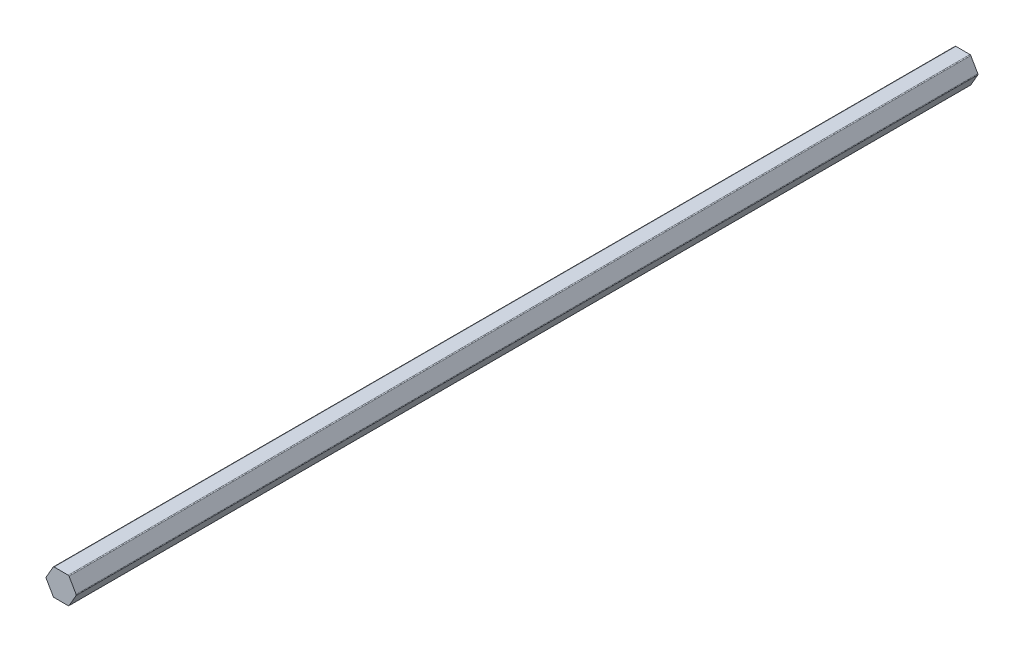
ISO-10303-21;
HEADER;
FILE_DESCRIPTION(('STEP AP214'),'2;1');
FILE_NAME('part.step','',(''),(''),'','','');
FILE_SCHEMA(('AUTOMOTIVE_DESIGN { 1 0 10303 214 1 1 1 1 }'));
ENDSEC;
DATA;
#1=APPLICATION_CONTEXT('core data for automotive mechanical design processes');
#2=APPLICATION_PROTOCOL_DEFINITION('international standard','automotive_design',2000,#1);
#3=PRODUCT_CONTEXT('',#1,'mechanical');
#4=PRODUCT('Part','Part','',(#3));
#5=PRODUCT_RELATED_PRODUCT_CATEGORY('part','',(#4));
#6=PRODUCT_DEFINITION_FORMATION('','',#4);
#7=PRODUCT_DEFINITION_CONTEXT('part definition',#1,'design');
#8=PRODUCT_DEFINITION('design','',#6,#7);
#9=PRODUCT_DEFINITION_SHAPE('','',#8);
#10=(LENGTH_UNIT() NAMED_UNIT(*) SI_UNIT(.MILLI.,.METRE.));
#11=(NAMED_UNIT(*) PLANE_ANGLE_UNIT() SI_UNIT($,.RADIAN.));
#12=(NAMED_UNIT(*) SI_UNIT($,.STERADIAN.) SOLID_ANGLE_UNIT());
#13=UNCERTAINTY_MEASURE_WITH_UNIT(LENGTH_MEASURE(1.E-05),#10,'distance_accuracy_value','');
#14=(GEOMETRIC_REPRESENTATION_CONTEXT(3) GLOBAL_UNCERTAINTY_ASSIGNED_CONTEXT((#13)) GLOBAL_UNIT_ASSIGNED_CONTEXT((#10,
#11,#12)) REPRESENTATION_CONTEXT('',''));
#15=CARTESIAN_POINT('',(0.,0.,0.));
#16=DIRECTION('',(0.,0.,1.));
#17=DIRECTION('',(1.,0.,0.));
#18=AXIS2_PLACEMENT_3D('',#15,#16,#17);
#19=CARTESIAN_POINT('',(-3.36554792418708,-5.8293,457.2));
#20=DIRECTION('',(0.,0.,-1.));
#21=DIRECTION('',(-1.,0.,0.));
#22=AXIS2_PLACEMENT_3D('',#19,#20,#21);
#23=CYLINDRICAL_SURFACE('',#22,0.508);
#24=CARTESIAN_POINT('',(-3.36554792418708,-5.8293,25.4));
#25=DIRECTION('',(0.,0.,1.));
#26=DIRECTION('',(1.,0.,0.));
#27=AXIS2_PLACEMENT_3D('',#24,#25,#26);
#28=CIRCLE('',#27,0.508);
#29=CARTESIAN_POINT('',(-3.36554792418708,-6.3373,25.4));
#30=VERTEX_POINT('',#29);
#31=CARTESIAN_POINT('',(-3.80548882930957,-6.0833,25.4));
#32=VERTEX_POINT('',#31);
#33=EDGE_CURVE('E193',#30,#32,#28,.F.);
#34=ORIENTED_EDGE('',*,*,#33,.F.);
#35=DIRECTION('',(0.,0.,1.));
#36=VECTOR('',#35,1.);
#37=CARTESIAN_POINT('',(-3.36554792418708,-6.3373,457.2));
#38=LINE('',#37,#36);
#39=CARTESIAN_POINT('',(-3.36554792418708,-6.3373,457.2));
#40=VERTEX_POINT('',#39);
#41=EDGE_CURVE('E185',#30,#40,#38,.T.);
#42=ORIENTED_EDGE('',*,*,#41,.T.);
#43=CARTESIAN_POINT('',(-3.36554792418708,-5.8293,457.2));
#44=DIRECTION('',(0.,0.,-1.));
#45=DIRECTION('',(-1.,0.,0.));
#46=AXIS2_PLACEMENT_3D('',#43,#44,#45);
#47=CIRCLE('',#46,0.508);
#48=CARTESIAN_POINT('',(-3.80548882930957,-6.0833,457.2));
#49=VERTEX_POINT('',#48);
#50=EDGE_CURVE('E121',#40,#49,#47,.T.);
#51=ORIENTED_EDGE('',*,*,#50,.T.);
#52=DIRECTION('',(0.,0.,1.));
#53=VECTOR('',#52,1.);
#54=CARTESIAN_POINT('',(-3.80548882930957,-6.0833,457.2));
#55=LINE('',#54,#53);
#56=EDGE_CURVE('E188',#49,#32,#55,.F.);
#57=ORIENTED_EDGE('',*,*,#56,.T.);
#58=EDGE_LOOP('',(#34,#42,#51,#57));
#59=FACE_BOUND('',#58,.T.);
#60=ADVANCED_FACE('F34',(#59),#23,.T.);
#61=CARTESIAN_POINT('',(3.36554792418708,5.8293,457.2));
#62=DIRECTION('',(0.,0.,-1.));
#63=DIRECTION('',(-1.,0.,0.));
#64=AXIS2_PLACEMENT_3D('',#61,#62,#63);
#65=CYLINDRICAL_SURFACE('',#64,0.508);
#66=CARTESIAN_POINT('',(3.36554792418708,5.8293,25.4));
#67=DIRECTION('',(0.,0.,1.));
#68=DIRECTION('',(1.,0.,0.));
#69=AXIS2_PLACEMENT_3D('',#66,#67,#68);
#70=CIRCLE('',#69,0.508);
#71=CARTESIAN_POINT('',(3.36554792418708,6.3373,25.4));
#72=VERTEX_POINT('',#71);
#73=CARTESIAN_POINT('',(3.80548882930958,6.0833,25.4));
#74=VERTEX_POINT('',#73);
#75=EDGE_CURVE('E244',#72,#74,#70,.F.);
#76=ORIENTED_EDGE('',*,*,#75,.F.);
#77=DIRECTION('',(0.,0.,1.));
#78=VECTOR('',#77,1.);
#79=CARTESIAN_POINT('',(3.36554792418708,6.3373,457.2));
#80=LINE('',#79,#78);
#81=CARTESIAN_POINT('',(3.36554792418708,6.3373,457.2));
#82=VERTEX_POINT('',#81);
#83=EDGE_CURVE('E178',#72,#82,#80,.T.);
#84=ORIENTED_EDGE('',*,*,#83,.T.);
#85=CARTESIAN_POINT('',(3.36554792418708,5.8293,457.2));
#86=DIRECTION('',(0.,0.,-1.));
#87=DIRECTION('',(-1.,0.,0.));
#88=AXIS2_PLACEMENT_3D('',#85,#86,#87);
#89=CIRCLE('',#88,0.508);
#90=CARTESIAN_POINT('',(3.80548882930958,6.0833,457.2));
#91=VERTEX_POINT('',#90);
#92=EDGE_CURVE('E145',#82,#91,#89,.T.);
#93=ORIENTED_EDGE('',*,*,#92,.T.);
#94=DIRECTION('',(0.,0.,1.));
#95=VECTOR('',#94,1.);
#96=CARTESIAN_POINT('',(3.80548882930958,6.0833,457.2));
#97=LINE('',#96,#95);
#98=EDGE_CURVE('E180',#91,#74,#97,.F.);
#99=ORIENTED_EDGE('',*,*,#98,.T.);
#100=EDGE_LOOP('',(#76,#84,#93,#99));
#101=FACE_BOUND('',#100,.T.);
#102=ADVANCED_FACE('F243',(#101),#65,.T.);
#103=CARTESIAN_POINT('',(-3.36554792418708,5.8293,457.2));
#104=DIRECTION('',(0.,0.,-1.));
#105=DIRECTION('',(-1.,0.,0.));
#106=AXIS2_PLACEMENT_3D('',#103,#104,#105);
#107=CYLINDRICAL_SURFACE('',#106,0.508);
#108=CARTESIAN_POINT('',(-3.36554792418708,5.8293,25.4));
#109=DIRECTION('',(0.,0.,1.));
#110=DIRECTION('',(1.,0.,0.));
#111=AXIS2_PLACEMENT_3D('',#108,#109,#110);
#112=CIRCLE('',#111,0.508);
#113=CARTESIAN_POINT('',(-3.80548882930958,6.0833,25.4));
#114=VERTEX_POINT('',#113);
#115=CARTESIAN_POINT('',(-3.36554792418708,6.3373,25.4));
#116=VERTEX_POINT('',#115);
#117=EDGE_CURVE('E149',#114,#116,#112,.F.);
#118=ORIENTED_EDGE('',*,*,#117,.F.);
#119=DIRECTION('',(0.,0.,1.));
#120=VECTOR('',#119,1.);
#121=CARTESIAN_POINT('',(-3.80548882930958,6.0833,457.2));
#122=LINE('',#121,#120);
#123=CARTESIAN_POINT('',(-3.80548882930958,6.0833,457.2));
#124=VERTEX_POINT('',#123);
#125=EDGE_CURVE('E173',#114,#124,#122,.T.);
#126=ORIENTED_EDGE('',*,*,#125,.T.);
#127=CARTESIAN_POINT('',(-3.36554792418708,5.8293,457.2));
#128=DIRECTION('',(0.,0.,-1.));
#129=DIRECTION('',(-1.,0.,0.));
#130=AXIS2_PLACEMENT_3D('',#127,#128,#129);
#131=CIRCLE('',#130,0.508);
#132=CARTESIAN_POINT('',(-3.36554792418708,6.3373,457.2));
#133=VERTEX_POINT('',#132);
#134=EDGE_CURVE('E143',#124,#133,#131,.T.);
#135=ORIENTED_EDGE('',*,*,#134,.T.);
#136=DIRECTION('',(0.,0.,1.));
#137=VECTOR('',#136,1.);
#138=CARTESIAN_POINT('',(-3.36554792418708,6.3373,457.2));
#139=LINE('',#138,#137);
#140=EDGE_CURVE('E176',#133,#116,#139,.F.);
#141=ORIENTED_EDGE('',*,*,#140,.T.);
#142=EDGE_LOOP('',(#118,#126,#135,#141));
#143=FACE_BOUND('',#142,.T.);
#144=ADVANCED_FACE('F208',(#143),#107,.T.);
#145=CARTESIAN_POINT('',(-6.73109584837417,0.,457.2));
#146=DIRECTION('',(0.,0.,-1.));
#147=DIRECTION('',(-1.,0.,0.));
#148=AXIS2_PLACEMENT_3D('',#145,#146,#147);
#149=CYLINDRICAL_SURFACE('',#148,0.508);
#150=CARTESIAN_POINT('',(-6.73109584837417,0.,25.4));
#151=DIRECTION('',(0.,0.,1.));
#152=DIRECTION('',(1.,0.,0.));
#153=AXIS2_PLACEMENT_3D('',#150,#151,#152);
#154=CIRCLE('',#153,0.508);
#155=CARTESIAN_POINT('',(-7.17103675349666,-0.254000000000004,25.4));
#156=VERTEX_POINT('',#155);
#157=CARTESIAN_POINT('',(-7.17103675349666,0.253999999999995,25.4));
#158=VERTEX_POINT('',#157);
#159=EDGE_CURVE('E155',#156,#158,#154,.F.);
#160=ORIENTED_EDGE('',*,*,#159,.F.);
#161=DIRECTION('',(0.,0.,1.));
#162=VECTOR('',#161,1.);
#163=CARTESIAN_POINT('',(-7.17103675349666,-0.254000000000004,457.2));
#164=LINE('',#163,#162);
#165=CARTESIAN_POINT('',(-7.17103675349666,-0.254000000000004,457.2));
#166=VERTEX_POINT('',#165);
#167=EDGE_CURVE('E91',#156,#166,#164,.T.);
#168=ORIENTED_EDGE('',*,*,#167,.T.);
#169=CARTESIAN_POINT('',(-6.73109584837417,0.,457.2));
#170=DIRECTION('',(0.,0.,-1.));
#171=DIRECTION('',(-1.,0.,0.));
#172=AXIS2_PLACEMENT_3D('',#169,#170,#171);
#173=CIRCLE('',#172,0.508);
#174=CARTESIAN_POINT('',(-7.17103675349666,0.253999999999996,457.2));
#175=VERTEX_POINT('',#174);
#176=EDGE_CURVE('E141',#166,#175,#173,.T.);
#177=ORIENTED_EDGE('',*,*,#176,.T.);
#178=DIRECTION('',(0.,0.,1.));
#179=VECTOR('',#178,1.);
#180=CARTESIAN_POINT('',(-7.17103675349666,0.253999999999996,457.2));
#181=LINE('',#180,#179);
#182=EDGE_CURVE('E175',#175,#158,#181,.F.);
#183=ORIENTED_EDGE('',*,*,#182,.T.);
#184=EDGE_LOOP('',(#160,#168,#177,#183));
#185=FACE_BOUND('',#184,.T.);
#186=ADVANCED_FACE('F205',(#185),#149,.T.);
#187=CARTESIAN_POINT('',(-7.31768372187083,0.,457.2));
#188=DIRECTION('',(0.866025403784438,0.5,0.));
#189=DIRECTION('',(-0.5,0.866025403784438,0.));
#190=AXIS2_PLACEMENT_3D('',#187,#188,#189);
#191=PLANE('',#190);
#192=ORIENTED_EDGE('',*,*,#167,.F.);
#193=DIRECTION('',(0.5,-0.866025403784438,0.));
#194=VECTOR('',#193,1.);
#195=CARTESIAN_POINT('',(-7.31768372187083,0.,25.4));
#196=LINE('',#195,#194);
#197=EDGE_CURVE('E202',#156,#32,#196,.T.);
#198=ORIENTED_EDGE('',*,*,#197,.T.);
#199=ORIENTED_EDGE('',*,*,#56,.F.);
#200=DIRECTION('',(0.500000000000001,-0.866025403784438,0.));
#201=VECTOR('',#200,1.);
#202=CARTESIAN_POINT('',(-7.17103675349666,-0.254000000000004,457.2));
#203=LINE('',#202,#201);
#204=EDGE_CURVE('E124',#166,#49,#203,.T.);
#205=ORIENTED_EDGE('',*,*,#204,.F.);
#206=EDGE_LOOP('',(#192,#198,#199,#205));
#207=FACE_BOUND('',#206,.T.);
#208=ADVANCED_FACE('F200',(#207),#191,.F.);
#209=CARTESIAN_POINT('',(-3.65884186093541,-6.3373,457.2));
#210=DIRECTION('',(0.,1.,0.));
#211=DIRECTION('',(-1.,0.,0.));
#212=AXIS2_PLACEMENT_3D('',#209,#210,#211);
#213=PLANE('',#212);
#214=ORIENTED_EDGE('',*,*,#41,.F.);
#215=DIRECTION('',(1.,0.,0.));
#216=VECTOR('',#215,1.);
#217=CARTESIAN_POINT('',(-3.65884186093541,-6.3373,25.4));
#218=LINE('',#217,#216);
#219=CARTESIAN_POINT('',(3.36554792418708,-6.3373,25.4));
#220=VERTEX_POINT('',#219);
#221=EDGE_CURVE('E132',#30,#220,#218,.T.);
#222=ORIENTED_EDGE('',*,*,#221,.T.);
#223=DIRECTION('',(0.,0.,-1.));
#224=VECTOR('',#223,1.);
#225=CARTESIAN_POINT('',(3.36554792418708,-6.3373,457.2));
#226=LINE('',#225,#224);
#227=CARTESIAN_POINT('',(3.36554792418708,-6.3373,457.2));
#228=VERTEX_POINT('',#227);
#229=EDGE_CURVE('E128',#228,#220,#226,.T.);
#230=ORIENTED_EDGE('',*,*,#229,.F.);
#231=DIRECTION('',(1.,0.,0.));
#232=VECTOR('',#231,1.);
#233=CARTESIAN_POINT('',(7.31768372187083,-6.3373,457.2));
#234=LINE('',#233,#232);
#235=EDGE_CURVE('E114',#40,#228,#234,.T.);
#236=ORIENTED_EDGE('',*,*,#235,.F.);
#237=EDGE_LOOP('',(#214,#222,#230,#236));
#238=FACE_BOUND('',#237,.T.);
#239=ADVANCED_FACE('F129',(#238),#213,.F.);
#240=CARTESIAN_POINT('',(7.31768372187083,0.,457.2));
#241=DIRECTION('',(-0.866025403784439,-0.5,0.));
#242=DIRECTION('',(0.5,-0.866025403784439,0.));
#243=AXIS2_PLACEMENT_3D('',#240,#241,#242);
#244=PLANE('',#243);
#245=DIRECTION('',(0.,0.,-1.));
#246=VECTOR('',#245,1.);
#247=CARTESIAN_POINT('',(7.17103675349666,0.254000000000004,457.2));
#248=LINE('',#247,#246);
#249=CARTESIAN_POINT('',(7.17103675349666,0.254000000000003,25.4));
#250=VERTEX_POINT('',#249);
#251=CARTESIAN_POINT('',(7.17103675349666,0.254000000000003,457.2));
#252=VERTEX_POINT('',#251);
#253=EDGE_CURVE('E108',#250,#252,#248,.F.);
#254=ORIENTED_EDGE('',*,*,#253,.F.);
#255=DIRECTION('',(-0.5,0.866025403784439,0.));
#256=VECTOR('',#255,1.);
#257=CARTESIAN_POINT('',(7.31768372187083,0.,25.4));
#258=LINE('',#257,#256);
#259=EDGE_CURVE('E240',#250,#74,#258,.T.);
#260=ORIENTED_EDGE('',*,*,#259,.T.);
#261=ORIENTED_EDGE('',*,*,#98,.F.);
#262=DIRECTION('',(-0.5,0.866025403784438,0.));
#263=VECTOR('',#262,1.);
#264=CARTESIAN_POINT('',(7.17103675349666,0.254000000000003,457.2));
#265=LINE('',#264,#263);
#266=EDGE_CURVE('E137',#252,#91,#265,.T.);
#267=ORIENTED_EDGE('',*,*,#266,.F.);
#268=EDGE_LOOP('',(#254,#260,#261,#267));
#269=FACE_BOUND('',#268,.T.);
#270=ADVANCED_FACE('F238',(#269),#244,.F.);
#271=CARTESIAN_POINT('',(3.65884186093541,6.3373,457.2));
#272=DIRECTION('',(0.,-1.,0.));
#273=DIRECTION('',(1.,0.,0.));
#274=AXIS2_PLACEMENT_3D('',#271,#272,#273);
#275=PLANE('',#274);
#276=ORIENTED_EDGE('',*,*,#83,.F.);
#277=DIRECTION('',(-1.,0.,0.));
#278=VECTOR('',#277,1.);
#279=CARTESIAN_POINT('',(3.65884186093541,6.3373,25.4));
#280=LINE('',#279,#278);
#281=EDGE_CURVE('E217',#72,#116,#280,.T.);
#282=ORIENTED_EDGE('',*,*,#281,.T.);
#283=ORIENTED_EDGE('',*,*,#140,.F.);
#284=DIRECTION('',(1.,0.,0.));
#285=VECTOR('',#284,1.);
#286=CARTESIAN_POINT('',(7.31768372187083,6.3373,457.2));
#287=LINE('',#286,#285);
#288=EDGE_CURVE('E163',#82,#133,#287,.F.);
#289=ORIENTED_EDGE('',*,*,#288,.F.);
#290=EDGE_LOOP('',(#276,#282,#283,#289));
#291=FACE_BOUND('',#290,.T.);
#292=ADVANCED_FACE('F214',(#291),#275,.F.);
#293=CARTESIAN_POINT('',(-3.65884186093541,6.3373,457.2));
#294=DIRECTION('',(0.866025403784439,-0.5,0.));
#295=DIRECTION('',(0.5,0.866025403784439,0.));
#296=AXIS2_PLACEMENT_3D('',#293,#294,#295);
#297=PLANE('',#296);
#298=ORIENTED_EDGE('',*,*,#125,.F.);
#299=DIRECTION('',(-0.5,-0.866025403784439,0.));
#300=VECTOR('',#299,1.);
#301=CARTESIAN_POINT('',(-3.65884186093541,6.3373,25.4));
#302=LINE('',#301,#300);
#303=EDGE_CURVE('E99',#114,#158,#302,.T.);
#304=ORIENTED_EDGE('',*,*,#303,.T.);
#305=ORIENTED_EDGE('',*,*,#182,.F.);
#306=DIRECTION('',(-0.5,-0.866025403784439,0.));
#307=VECTOR('',#306,1.);
#308=CARTESIAN_POINT('',(-3.80548882930958,6.0833,457.2));
#309=LINE('',#308,#307);
#310=EDGE_CURVE('E159',#124,#175,#309,.T.);
#311=ORIENTED_EDGE('',*,*,#310,.F.);
#312=EDGE_LOOP('',(#298,#304,#305,#311));
#313=FACE_BOUND('',#312,.T.);
#314=ADVANCED_FACE('F206',(#313),#297,.F.);
#315=CARTESIAN_POINT('',(6.73109584837417,0.,457.2));
#316=DIRECTION('',(0.,0.,-1.));
#317=DIRECTION('',(-1.,0.,0.));
#318=AXIS2_PLACEMENT_3D('',#315,#316,#317);
#319=CYLINDRICAL_SURFACE('',#318,0.508);
#320=CARTESIAN_POINT('',(6.73109584837417,0.,25.4));
#321=DIRECTION('',(0.,0.,1.));
#322=DIRECTION('',(1.,0.,0.));
#323=AXIS2_PLACEMENT_3D('',#320,#321,#322);
#324=CIRCLE('',#323,0.508);
#325=CARTESIAN_POINT('',(7.17103675349666,-0.253999999999996,25.3999999999998));
#326=VERTEX_POINT('',#325);
#327=EDGE_CURVE('E48',#250,#326,#324,.F.);
#328=ORIENTED_EDGE('',*,*,#327,.F.);
#329=ORIENTED_EDGE('',*,*,#253,.T.);
#330=CARTESIAN_POINT('',(6.73109584837417,0.,457.2));
#331=DIRECTION('',(0.,0.,-1.));
#332=DIRECTION('',(-1.,0.,0.));
#333=AXIS2_PLACEMENT_3D('',#330,#331,#332);
#334=CIRCLE('',#333,0.508);
#335=CARTESIAN_POINT('',(7.17103675349667,-0.253999999999996,457.2));
#336=VERTEX_POINT('',#335);
#337=EDGE_CURVE('E135',#336,#252,#334,.F.);
#338=ORIENTED_EDGE('',*,*,#337,.F.);
#339=DIRECTION('',(0.,0.,1.));
#340=VECTOR('',#339,1.);
#341=CARTESIAN_POINT('',(7.17103675349666,-0.253999999999996,457.2));
#342=LINE('',#341,#340);
#343=EDGE_CURVE('E162',#336,#326,#342,.F.);
#344=ORIENTED_EDGE('',*,*,#343,.T.);
#345=EDGE_LOOP('',(#328,#329,#338,#344));
#346=FACE_BOUND('',#345,.T.);
#347=ADVANCED_FACE('F252',(#346),#319,.T.);
#348=CARTESIAN_POINT('',(3.36554792418709,-5.8293,457.2));
#349=DIRECTION('',(0.,0.,-1.));
#350=DIRECTION('',(-1.,0.,0.));
#351=AXIS2_PLACEMENT_3D('',#348,#349,#350);
#352=CYLINDRICAL_SURFACE('',#351,0.508);
#353=CARTESIAN_POINT('',(3.36554792418709,-5.8293,25.4));
#354=DIRECTION('',(0.,0.,1.));
#355=DIRECTION('',(1.,0.,0.));
#356=AXIS2_PLACEMENT_3D('',#353,#354,#355);
#357=CIRCLE('',#356,0.508);
#358=CARTESIAN_POINT('',(3.80548882930958,-6.0833,25.4));
#359=VERTEX_POINT('',#358);
#360=EDGE_CURVE('E231',#359,#220,#357,.F.);
#361=ORIENTED_EDGE('',*,*,#360,.F.);
#362=DIRECTION('',(0.,0.,1.));
#363=VECTOR('',#362,1.);
#364=CARTESIAN_POINT('',(3.80548882930958,-6.0833,457.2));
#365=LINE('',#364,#363);
#366=CARTESIAN_POINT('',(3.80548882930958,-6.0833,457.2));
#367=VERTEX_POINT('',#366);
#368=EDGE_CURVE('E56',#359,#367,#365,.T.);
#369=ORIENTED_EDGE('',*,*,#368,.T.);
#370=CARTESIAN_POINT('',(3.36554792418709,-5.8293,457.2));
#371=DIRECTION('',(0.,0.,-1.));
#372=DIRECTION('',(-1.,0.,0.));
#373=AXIS2_PLACEMENT_3D('',#370,#371,#372);
#374=CIRCLE('',#373,0.508);
#375=EDGE_CURVE('E118',#228,#367,#374,.F.);
#376=ORIENTED_EDGE('',*,*,#375,.F.);
#377=ORIENTED_EDGE('',*,*,#229,.T.);
#378=EDGE_LOOP('',(#361,#369,#376,#377));
#379=FACE_BOUND('',#378,.T.);
#380=ADVANCED_FACE('F134',(#379),#352,.T.);
#381=CARTESIAN_POINT('',(7.31768372187083,0.,457.2));
#382=DIRECTION('',(0.,0.,1.));
#383=DIRECTION('',(1.,0.,0.));
#384=AXIS2_PLACEMENT_3D('',#381,#382,#383);
#385=PLANE('',#384);
#386=ORIENTED_EDGE('',*,*,#176,.F.);
#387=ORIENTED_EDGE('',*,*,#204,.T.);
#388=ORIENTED_EDGE('',*,*,#50,.F.);
#389=ORIENTED_EDGE('',*,*,#235,.T.);
#390=ORIENTED_EDGE('',*,*,#375,.T.);
#391=DIRECTION('',(-0.5,-0.866025403784439,0.));
#392=VECTOR('',#391,1.);
#393=CARTESIAN_POINT('',(3.65884186093542,-6.3373,457.2));
#394=LINE('',#393,#392);
#395=EDGE_CURVE('E41',#367,#336,#394,.F.);
#396=ORIENTED_EDGE('',*,*,#395,.T.);
#397=ORIENTED_EDGE('',*,*,#337,.T.);
#398=ORIENTED_EDGE('',*,*,#266,.T.);
#399=ORIENTED_EDGE('',*,*,#92,.F.);
#400=ORIENTED_EDGE('',*,*,#288,.T.);
#401=ORIENTED_EDGE('',*,*,#134,.F.);
#402=ORIENTED_EDGE('',*,*,#310,.T.);
#403=EDGE_LOOP('',(#386,#387,#388,#389,#390,#396,#397,#398,#399,#400,#401,#402));
#404=FACE_BOUND('',#403,.T.);
#405=ADVANCED_FACE('F116',(#404),#385,.T.);
#406=CARTESIAN_POINT('',(3.65884186093542,-6.3373,457.2));
#407=DIRECTION('',(-0.866025403784439,0.5,0.));
#408=DIRECTION('',(-0.5,-0.866025403784439,0.));
#409=AXIS2_PLACEMENT_3D('',#406,#407,#408);
#410=PLANE('',#409);
#411=ORIENTED_EDGE('',*,*,#368,.F.);
#412=DIRECTION('',(0.5,0.866025403784439,0.));
#413=VECTOR('',#412,1.);
#414=CARTESIAN_POINT('',(3.65884186093542,-6.3373,25.4));
#415=LINE('',#414,#413);
#416=EDGE_CURVE('E11',#359,#326,#415,.T.);
#417=ORIENTED_EDGE('',*,*,#416,.T.);
#418=ORIENTED_EDGE('',*,*,#343,.F.);
#419=ORIENTED_EDGE('',*,*,#395,.F.);
#420=EDGE_LOOP('',(#411,#417,#418,#419));
#421=FACE_BOUND('',#420,.T.);
#422=ADVANCED_FACE('F234',(#421),#410,.F.);
#423=CARTESIAN_POINT('',(0.,0.,25.4));
#424=DIRECTION('',(0.,0.,1.));
#425=DIRECTION('',(1.,0.,0.));
#426=AXIS2_PLACEMENT_3D('',#423,#424,#425);
#427=PLANE('',#426);
#428=ORIENTED_EDGE('',*,*,#117,.T.);
#429=ORIENTED_EDGE('',*,*,#281,.F.);
#430=ORIENTED_EDGE('',*,*,#75,.T.);
#431=ORIENTED_EDGE('',*,*,#259,.F.);
#432=ORIENTED_EDGE('',*,*,#327,.T.);
#433=ORIENTED_EDGE('',*,*,#416,.F.);
#434=ORIENTED_EDGE('',*,*,#360,.T.);
#435=ORIENTED_EDGE('',*,*,#221,.F.);
#436=ORIENTED_EDGE('',*,*,#33,.T.);
#437=ORIENTED_EDGE('',*,*,#197,.F.);
#438=ORIENTED_EDGE('',*,*,#159,.T.);
#439=ORIENTED_EDGE('',*,*,#303,.F.);
#440=EDGE_LOOP('',(#428,#429,#430,#431,#432,#433,#434,#435,#436,#437,#438,#439));
#441=FACE_BOUND('',#440,.T.);
#442=ADVANCED_FACE('F230',(#441),#427,.F.);
#443=CLOSED_SHELL('',(#60,#102,#144,#186,#208,#239,#270,#292,#314,#347,#380,#405,#422,#442));
#444=MANIFOLD_SOLID_BREP('B2',#443);
#445=ADVANCED_BREP_SHAPE_REPRESENTATION('',(#18,#444),#14);
#446=SHAPE_DEFINITION_REPRESENTATION(#9,#445);
ENDSEC;
END-ISO-10303-21;
